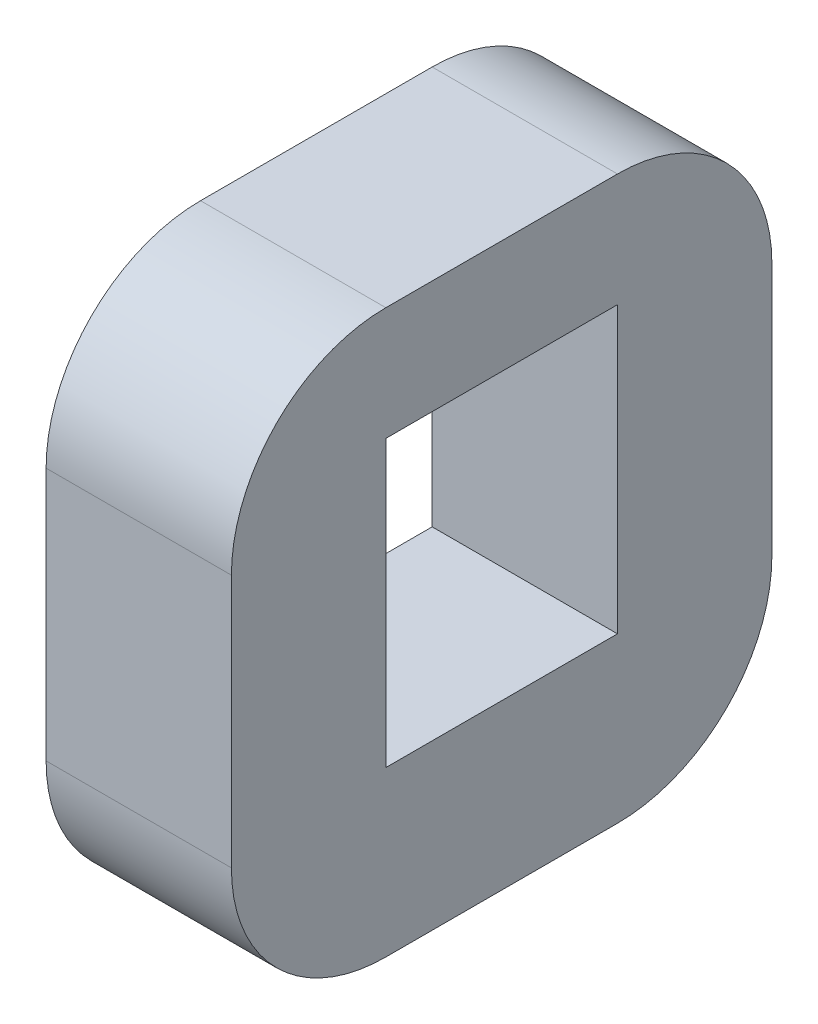
ISO-10303-21;
HEADER;
FILE_DESCRIPTION(('STEP AP214'),'2;1');
FILE_NAME('part.step','',(''),(''),'','','');
FILE_SCHEMA(('AUTOMOTIVE_DESIGN { 1 0 10303 214 1 1 1 1 }'));
ENDSEC;
DATA;
#1=APPLICATION_CONTEXT('core data for automotive mechanical design processes');
#2=APPLICATION_PROTOCOL_DEFINITION('international standard','automotive_design',2000,#1);
#3=PRODUCT_CONTEXT('',#1,'mechanical');
#4=PRODUCT('Part','Part','',(#3));
#5=PRODUCT_RELATED_PRODUCT_CATEGORY('part','',(#4));
#6=PRODUCT_DEFINITION_FORMATION('','',#4);
#7=PRODUCT_DEFINITION_CONTEXT('part definition',#1,'design');
#8=PRODUCT_DEFINITION('design','',#6,#7);
#9=PRODUCT_DEFINITION_SHAPE('','',#8);
#10=(LENGTH_UNIT() NAMED_UNIT(*) SI_UNIT(.MILLI.,.METRE.));
#11=(NAMED_UNIT(*) PLANE_ANGLE_UNIT() SI_UNIT($,.RADIAN.));
#12=(NAMED_UNIT(*) SI_UNIT($,.STERADIAN.) SOLID_ANGLE_UNIT());
#13=UNCERTAINTY_MEASURE_WITH_UNIT(LENGTH_MEASURE(1.E-05),#10,'distance_accuracy_value','');
#14=(GEOMETRIC_REPRESENTATION_CONTEXT(3) GLOBAL_UNCERTAINTY_ASSIGNED_CONTEXT((#13)) GLOBAL_UNIT_ASSIGNED_CONTEXT((#10,
#11,#12)) REPRESENTATION_CONTEXT('',''));
#15=CARTESIAN_POINT('',(0.,0.,0.));
#16=DIRECTION('',(0.,0.,1.));
#17=DIRECTION('',(1.,0.,0.));
#18=AXIS2_PLACEMENT_3D('',#15,#16,#17);
#19=CARTESIAN_POINT('',(-32.2981540502499,5.50000000000233,-0.749999999999997));
#20=DIRECTION('',(-1.,0.,0.));
#21=DIRECTION('',(0.,-1.,0.));
#22=AXIS2_PLACEMENT_3D('',#19,#20,#21);
#23=PLANE('',#22);
#24=CARTESIAN_POINT('',(-32.2981540502499,5.50000000000233,-0.749999999999997));
#25=DIRECTION('',(-1.,0.,0.));
#26=DIRECTION('',(0.,-1.,0.));
#27=AXIS2_PLACEMENT_3D('',#24,#25,#26);
#28=CIRCLE('',#27,5.);
#29=CARTESIAN_POINT('',(-32.2981540502497,10.5000000000023,-0.749999999999997));
#30=VERTEX_POINT('',#29);
#31=CARTESIAN_POINT('',(-32.2981540502499,5.50000000000233,-5.75));
#32=VERTEX_POINT('',#31);
#33=EDGE_CURVE('E154',#30,#32,#28,.T.);
#34=ORIENTED_EDGE('',*,*,#33,.T.);
#35=DIRECTION('',(0.,-1.,0.));
#36=VECTOR('',#35,1.);
#37=CARTESIAN_POINT('',(-32.2981540502499,5.50000000000233,-5.75));
#38=LINE('',#37,#36);
#39=CARTESIAN_POINT('',(-32.29815405025,-2.70774354332362,-5.75));
#40=VERTEX_POINT('',#39);
#41=EDGE_CURVE('E157',#32,#40,#38,.T.);
#42=ORIENTED_EDGE('',*,*,#41,.T.);
#43=CARTESIAN_POINT('',(-32.29815405025,-2.70774354332362,-0.749999999999997));
#44=DIRECTION('',(-1.,0.,0.));
#45=DIRECTION('',(0.,-1.,0.));
#46=AXIS2_PLACEMENT_3D('',#43,#44,#45);
#47=CIRCLE('',#46,5.);
#48=CARTESIAN_POINT('',(-32.2981540502502,-7.70774354332362,-0.749999999999997));
#49=VERTEX_POINT('',#48);
#50=EDGE_CURVE('E160',#40,#49,#47,.T.);
#51=ORIENTED_EDGE('',*,*,#50,.T.);
#52=DIRECTION('',(0.,0.,1.));
#53=VECTOR('',#52,1.);
#54=CARTESIAN_POINT('',(-32.2981540502502,-7.70774354332362,-0.749999999999998));
#55=LINE('',#54,#53);
#56=CARTESIAN_POINT('',(-32.2981540502502,-7.70774354332362,6.75));
#57=VERTEX_POINT('',#56);
#58=EDGE_CURVE('E162',#49,#57,#55,.T.);
#59=ORIENTED_EDGE('',*,*,#58,.T.);
#60=CARTESIAN_POINT('',(-32.29815405025,-2.70774354332362,6.75));
#61=DIRECTION('',(-1.,0.,0.));
#62=DIRECTION('',(0.,-1.,0.));
#63=AXIS2_PLACEMENT_3D('',#60,#61,#62);
#64=CIRCLE('',#63,5.);
#65=CARTESIAN_POINT('',(-32.29815405025,-2.70774354332362,11.75));
#66=VERTEX_POINT('',#65);
#67=EDGE_CURVE('E164',#57,#66,#64,.T.);
#68=ORIENTED_EDGE('',*,*,#67,.T.);
#69=DIRECTION('',(0.,1.,0.));
#70=VECTOR('',#69,1.);
#71=CARTESIAN_POINT('',(-32.29815405025,-2.70774354332362,11.75));
#72=LINE('',#71,#70);
#73=CARTESIAN_POINT('',(-32.2981540502499,5.50000000000233,11.75));
#74=VERTEX_POINT('',#73);
#75=EDGE_CURVE('E166',#66,#74,#72,.T.);
#76=ORIENTED_EDGE('',*,*,#75,.T.);
#77=CARTESIAN_POINT('',(-32.2981540502499,5.50000000000232,6.75));
#78=DIRECTION('',(-1.,0.,0.));
#79=DIRECTION('',(0.,-1.,0.));
#80=AXIS2_PLACEMENT_3D('',#77,#78,#79);
#81=CIRCLE('',#80,5.);
#82=CARTESIAN_POINT('',(-32.2981540502497,10.5000000000023,6.75));
#83=VERTEX_POINT('',#82);
#84=EDGE_CURVE('E168',#74,#83,#81,.T.);
#85=ORIENTED_EDGE('',*,*,#84,.T.);
#86=DIRECTION('',(0.,0.,-1.));
#87=VECTOR('',#86,1.);
#88=CARTESIAN_POINT('',(-32.2981540502497,10.5000000000023,6.75));
#89=LINE('',#88,#87);
#90=EDGE_CURVE('E170',#83,#30,#89,.T.);
#91=ORIENTED_EDGE('',*,*,#90,.T.);
#92=EDGE_LOOP('',(#34,#42,#51,#59,#68,#76,#85,#91));
#93=FACE_BOUND('',#92,.T.);
#94=DIRECTION('',(0.,1.,0.));
#95=VECTOR('',#94,1.);
#96=CARTESIAN_POINT('',(-32.29815405025,-2.39499999999976,6.75));
#97=LINE('',#96,#95);
#98=CARTESIAN_POINT('',(-32.29815405025,-2.39499999999976,6.75));
#99=VERTEX_POINT('',#98);
#100=CARTESIAN_POINT('',(-32.2981540502498,6.83500000000231,6.75));
#101=VERTEX_POINT('',#100);
#102=EDGE_CURVE('E136',#99,#101,#97,.T.);
#103=ORIENTED_EDGE('',*,*,#102,.F.);
#104=DIRECTION('',(0.,0.,1.));
#105=VECTOR('',#104,1.);
#106=CARTESIAN_POINT('',(-32.29815405025,-2.39499999999976,-0.749999999999996));
#107=LINE('',#106,#105);
#108=CARTESIAN_POINT('',(-32.29815405025,-2.39499999999976,-0.749999999999996));
#109=VERTEX_POINT('',#108);
#110=EDGE_CURVE('E122',#109,#99,#107,.T.);
#111=ORIENTED_EDGE('',*,*,#110,.F.);
#112=DIRECTION('',(0.,-1.,0.));
#113=VECTOR('',#112,1.);
#114=CARTESIAN_POINT('',(-32.29815405025,-0.354999999997694,-0.749999999999997));
#115=LINE('',#114,#113);
#116=CARTESIAN_POINT('',(-32.2981540502498,6.83500000000231,-0.749999999999996));
#117=VERTEX_POINT('',#116);
#118=EDGE_CURVE('E117',#117,#109,#115,.T.);
#119=ORIENTED_EDGE('',*,*,#118,.F.);
#120=DIRECTION('',(0.,0.,-1.));
#121=VECTOR('',#120,1.);
#122=CARTESIAN_POINT('',(-32.2981540502498,6.83500000000231,-0.749999999999996));
#123=LINE('',#122,#121);
#124=EDGE_CURVE('E138',#101,#117,#123,.T.);
#125=ORIENTED_EDGE('',*,*,#124,.F.);
#126=EDGE_LOOP('',(#103,#111,#119,#125));
#127=FACE_BOUND('',#126,.T.);
#128=ADVANCED_FACE('F31',(#93,#127),#23,.T.);
#129=CARTESIAN_POINT('',(-26.2981540502499,5.50000000000218,-0.749999999999997));
#130=DIRECTION('',(-1.,0.,0.));
#131=DIRECTION('',(0.,-1.,0.));
#132=AXIS2_PLACEMENT_3D('',#129,#130,#131);
#133=PLANE('',#132);
#134=CARTESIAN_POINT('',(-26.2981540502499,5.50000000000218,-0.749999999999997));
#135=DIRECTION('',(-1.,0.,0.));
#136=DIRECTION('',(0.,-1.,0.));
#137=AXIS2_PLACEMENT_3D('',#134,#135,#136);
#138=CIRCLE('',#137,5.);
#139=CARTESIAN_POINT('',(-26.2981540502497,10.5000000000022,-0.749999999999997));
#140=VERTEX_POINT('',#139);
#141=CARTESIAN_POINT('',(-26.2981540502499,5.50000000000218,-5.75));
#142=VERTEX_POINT('',#141);
#143=EDGE_CURVE('E132',#140,#142,#138,.T.);
#144=ORIENTED_EDGE('',*,*,#143,.F.);
#145=DIRECTION('',(0.,0.,-1.));
#146=VECTOR('',#145,1.);
#147=CARTESIAN_POINT('',(-26.2981540502497,10.5000000000022,6.75));
#148=LINE('',#147,#146);
#149=CARTESIAN_POINT('',(-26.2981540502497,10.5000000000022,6.75));
#150=VERTEX_POINT('',#149);
#151=EDGE_CURVE('E158',#150,#140,#148,.T.);
#152=ORIENTED_EDGE('',*,*,#151,.F.);
#153=CARTESIAN_POINT('',(-26.2981540502499,5.50000000000218,6.75));
#154=DIRECTION('',(-1.,0.,0.));
#155=DIRECTION('',(0.,-1.,0.));
#156=AXIS2_PLACEMENT_3D('',#153,#154,#155);
#157=CIRCLE('',#156,5.);
#158=CARTESIAN_POINT('',(-26.2981540502499,5.50000000000218,11.75));
#159=VERTEX_POINT('',#158);
#160=EDGE_CURVE('E185',#159,#150,#157,.T.);
#161=ORIENTED_EDGE('',*,*,#160,.F.);
#162=DIRECTION('',(0.,1.,0.));
#163=VECTOR('',#162,1.);
#164=CARTESIAN_POINT('',(-26.2981540502501,-2.70774354332377,11.75));
#165=LINE('',#164,#163);
#166=CARTESIAN_POINT('',(-26.2981540502501,-2.70774354332377,11.75));
#167=VERTEX_POINT('',#166);
#168=EDGE_CURVE('E183',#167,#159,#165,.T.);
#169=ORIENTED_EDGE('',*,*,#168,.F.);
#170=CARTESIAN_POINT('',(-26.2981540502501,-2.70774354332377,6.75));
#171=DIRECTION('',(-1.,0.,0.));
#172=DIRECTION('',(0.,-1.,0.));
#173=AXIS2_PLACEMENT_3D('',#170,#171,#172);
#174=CIRCLE('',#173,5.);
#175=CARTESIAN_POINT('',(-26.2981540502502,-7.70774354332377,6.75));
#176=VERTEX_POINT('',#175);
#177=EDGE_CURVE('E181',#176,#167,#174,.T.);
#178=ORIENTED_EDGE('',*,*,#177,.F.);
#179=DIRECTION('',(0.,0.,1.));
#180=VECTOR('',#179,1.);
#181=CARTESIAN_POINT('',(-26.2981540502502,-7.70774354332377,-0.749999999999998));
#182=LINE('',#181,#180);
#183=CARTESIAN_POINT('',(-26.2981540502502,-7.70774354332377,-0.749999999999997));
#184=VERTEX_POINT('',#183);
#185=EDGE_CURVE('E179',#184,#176,#182,.T.);
#186=ORIENTED_EDGE('',*,*,#185,.F.);
#187=CARTESIAN_POINT('',(-26.2981540502501,-2.70774354332377,-0.749999999999997));
#188=DIRECTION('',(-1.,0.,0.));
#189=DIRECTION('',(0.,-1.,0.));
#190=AXIS2_PLACEMENT_3D('',#187,#188,#189);
#191=CIRCLE('',#190,5.);
#192=CARTESIAN_POINT('',(-26.2981540502501,-2.70774354332377,-5.75));
#193=VERTEX_POINT('',#192);
#194=EDGE_CURVE('E177',#193,#184,#191,.T.);
#195=ORIENTED_EDGE('',*,*,#194,.F.);
#196=DIRECTION('',(0.,-1.,0.));
#197=VECTOR('',#196,1.);
#198=CARTESIAN_POINT('',(-26.2981540502499,5.50000000000218,-5.75));
#199=LINE('',#198,#197);
#200=EDGE_CURVE('E175',#142,#193,#199,.T.);
#201=ORIENTED_EDGE('',*,*,#200,.F.);
#202=EDGE_LOOP('',(#144,#152,#161,#169,#178,#186,#195,#201));
#203=FACE_BOUND('',#202,.T.);
#204=DIRECTION('',(0.,0.,1.));
#205=VECTOR('',#204,1.);
#206=CARTESIAN_POINT('',(-26.29815405025,-2.3949999999999,-0.749999999999996));
#207=LINE('',#206,#205);
#208=CARTESIAN_POINT('',(-26.29815405025,-2.39499999999991,-0.749999999999997));
#209=VERTEX_POINT('',#208);
#210=CARTESIAN_POINT('',(-26.29815405025,-2.3949999999999,6.75));
#211=VERTEX_POINT('',#210);
#212=EDGE_CURVE('E130',#209,#211,#207,.T.);
#213=ORIENTED_EDGE('',*,*,#212,.T.);
#214=DIRECTION('',(0.,1.,0.));
#215=VECTOR('',#214,1.);
#216=CARTESIAN_POINT('',(-26.2981540502498,6.83500000000216,6.75));
#217=LINE('',#216,#215);
#218=CARTESIAN_POINT('',(-26.2981540502498,6.83500000000216,6.75));
#219=VERTEX_POINT('',#218);
#220=EDGE_CURVE('E143',#211,#219,#217,.T.);
#221=ORIENTED_EDGE('',*,*,#220,.T.);
#222=DIRECTION('',(0.,0.,-1.));
#223=VECTOR('',#222,1.);
#224=CARTESIAN_POINT('',(-26.2981540502498,6.83500000000216,-0.749999999999996));
#225=LINE('',#224,#223);
#226=CARTESIAN_POINT('',(-26.2981540502498,6.83500000000216,-0.749999999999996));
#227=VERTEX_POINT('',#226);
#228=EDGE_CURVE('E146',#219,#227,#225,.T.);
#229=ORIENTED_EDGE('',*,*,#228,.T.);
#230=DIRECTION('',(0.,-1.,0.));
#231=VECTOR('',#230,1.);
#232=CARTESIAN_POINT('',(-26.29815405025,-0.354999999997839,-0.749999999999997));
#233=LINE('',#232,#231);
#234=EDGE_CURVE('E123',#227,#209,#233,.T.);
#235=ORIENTED_EDGE('',*,*,#234,.T.);
#236=EDGE_LOOP('',(#213,#221,#229,#235));
#237=FACE_BOUND('',#236,.T.);
#238=ADVANCED_FACE('F215',(#203,#237),#133,.F.);
#239=CARTESIAN_POINT('',(-32.2981540502499,5.50000000000233,-0.749999999999997));
#240=DIRECTION('',(1.,0.,0.));
#241=DIRECTION('',(0.,1.,0.));
#242=AXIS2_PLACEMENT_3D('',#239,#240,#241);
#243=CYLINDRICAL_SURFACE('',#242,5.);
#244=ORIENTED_EDGE('',*,*,#143,.T.);
#245=DIRECTION('',(1.,0.,0.));
#246=VECTOR('',#245,1.);
#247=CARTESIAN_POINT('',(-32.2981540502499,5.50000000000233,-5.75));
#248=LINE('',#247,#246);
#249=EDGE_CURVE('E11',#32,#142,#248,.T.);
#250=ORIENTED_EDGE('',*,*,#249,.F.);
#251=ORIENTED_EDGE('',*,*,#33,.F.);
#252=DIRECTION('',(1.,0.,0.));
#253=VECTOR('',#252,1.);
#254=CARTESIAN_POINT('',(-32.2981540502497,10.5000000000023,-0.749999999999997));
#255=LINE('',#254,#253);
#256=EDGE_CURVE('E172',#30,#140,#255,.T.);
#257=ORIENTED_EDGE('',*,*,#256,.T.);
#258=EDGE_LOOP('',(#244,#250,#251,#257));
#259=FACE_BOUND('',#258,.T.);
#260=ADVANCED_FACE('F33',(#259),#243,.T.);
#261=CARTESIAN_POINT('',(-32.2981540502499,5.50000000000233,-5.75));
#262=DIRECTION('',(0.,0.,1.));
#263=DIRECTION('',(1.,0.,0.));
#264=AXIS2_PLACEMENT_3D('',#261,#262,#263);
#265=PLANE('',#264);
#266=ORIENTED_EDGE('',*,*,#200,.T.);
#267=DIRECTION('',(1.,0.,0.));
#268=VECTOR('',#267,1.);
#269=CARTESIAN_POINT('',(-32.29815405025,-2.70774354332362,-5.75));
#270=LINE('',#269,#268);
#271=EDGE_CURVE('E39',#40,#193,#270,.T.);
#272=ORIENTED_EDGE('',*,*,#271,.F.);
#273=ORIENTED_EDGE('',*,*,#41,.F.);
#274=ORIENTED_EDGE('',*,*,#249,.T.);
#275=EDGE_LOOP('',(#266,#272,#273,#274));
#276=FACE_BOUND('',#275,.T.);
#277=ADVANCED_FACE('F232',(#276),#265,.F.);
#278=CARTESIAN_POINT('',(-32.29815405025,-2.70774354332362,-0.749999999999997));
#279=DIRECTION('',(1.,0.,0.));
#280=DIRECTION('',(0.,1.,0.));
#281=AXIS2_PLACEMENT_3D('',#278,#279,#280);
#282=CYLINDRICAL_SURFACE('',#281,5.);
#283=ORIENTED_EDGE('',*,*,#194,.T.);
#284=DIRECTION('',(1.,0.,0.));
#285=VECTOR('',#284,1.);
#286=CARTESIAN_POINT('',(-32.2981540502502,-7.70774354332362,-0.749999999999997));
#287=LINE('',#286,#285);
#288=EDGE_CURVE('E202',#49,#184,#287,.T.);
#289=ORIENTED_EDGE('',*,*,#288,.F.);
#290=ORIENTED_EDGE('',*,*,#50,.F.);
#291=ORIENTED_EDGE('',*,*,#271,.T.);
#292=EDGE_LOOP('',(#283,#289,#290,#291));
#293=FACE_BOUND('',#292,.T.);
#294=ADVANCED_FACE('F209',(#293),#282,.T.);
#295=CARTESIAN_POINT('',(-32.2981540502502,-7.70774354332362,-0.749999999999998));
#296=DIRECTION('',(0.,1.,0.));
#297=DIRECTION('',(-1.,0.,0.));
#298=AXIS2_PLACEMENT_3D('',#295,#296,#297);
#299=PLANE('',#298);
#300=ORIENTED_EDGE('',*,*,#185,.T.);
#301=DIRECTION('',(1.,0.,0.));
#302=VECTOR('',#301,1.);
#303=CARTESIAN_POINT('',(-32.2981540502502,-7.70774354332362,6.75));
#304=LINE('',#303,#302);
#305=EDGE_CURVE('E199',#57,#176,#304,.T.);
#306=ORIENTED_EDGE('',*,*,#305,.F.);
#307=ORIENTED_EDGE('',*,*,#58,.F.);
#308=ORIENTED_EDGE('',*,*,#288,.T.);
#309=EDGE_LOOP('',(#300,#306,#307,#308));
#310=FACE_BOUND('',#309,.T.);
#311=ADVANCED_FACE('F221',(#310),#299,.F.);
#312=CARTESIAN_POINT('',(-32.29815405025,-2.70774354332362,6.75));
#313=DIRECTION('',(1.,0.,0.));
#314=DIRECTION('',(0.,1.,0.));
#315=AXIS2_PLACEMENT_3D('',#312,#313,#314);
#316=CYLINDRICAL_SURFACE('',#315,5.);
#317=ORIENTED_EDGE('',*,*,#177,.T.);
#318=DIRECTION('',(1.,0.,0.));
#319=VECTOR('',#318,1.);
#320=CARTESIAN_POINT('',(-32.29815405025,-2.70774354332362,11.75));
#321=LINE('',#320,#319);
#322=EDGE_CURVE('E196',#66,#167,#321,.T.);
#323=ORIENTED_EDGE('',*,*,#322,.F.);
#324=ORIENTED_EDGE('',*,*,#67,.F.);
#325=ORIENTED_EDGE('',*,*,#305,.T.);
#326=EDGE_LOOP('',(#317,#323,#324,#325));
#327=FACE_BOUND('',#326,.T.);
#328=ADVANCED_FACE('F225',(#327),#316,.T.);
#329=CARTESIAN_POINT('',(-32.29815405025,-2.70774354332362,11.75));
#330=DIRECTION('',(0.,0.,-1.));
#331=DIRECTION('',(0.,1.,0.));
#332=AXIS2_PLACEMENT_3D('',#329,#330,#331);
#333=PLANE('',#332);
#334=ORIENTED_EDGE('',*,*,#168,.T.);
#335=DIRECTION('',(1.,0.,0.));
#336=VECTOR('',#335,1.);
#337=CARTESIAN_POINT('',(-32.2981540502499,5.50000000000233,11.75));
#338=LINE('',#337,#336);
#339=EDGE_CURVE('E193',#74,#159,#338,.T.);
#340=ORIENTED_EDGE('',*,*,#339,.F.);
#341=ORIENTED_EDGE('',*,*,#75,.F.);
#342=ORIENTED_EDGE('',*,*,#322,.T.);
#343=EDGE_LOOP('',(#334,#340,#341,#342));
#344=FACE_BOUND('',#343,.T.);
#345=ADVANCED_FACE('F245',(#344),#333,.F.);
#346=CARTESIAN_POINT('',(-32.2981540502499,5.50000000000232,6.75));
#347=DIRECTION('',(1.,0.,0.));
#348=DIRECTION('',(0.,1.,0.));
#349=AXIS2_PLACEMENT_3D('',#346,#347,#348);
#350=CYLINDRICAL_SURFACE('',#349,5.);
#351=ORIENTED_EDGE('',*,*,#160,.T.);
#352=DIRECTION('',(1.,0.,0.));
#353=VECTOR('',#352,1.);
#354=CARTESIAN_POINT('',(-32.2981540502497,10.5000000000023,6.75));
#355=LINE('',#354,#353);
#356=EDGE_CURVE('E190',#83,#150,#355,.T.);
#357=ORIENTED_EDGE('',*,*,#356,.F.);
#358=ORIENTED_EDGE('',*,*,#84,.F.);
#359=ORIENTED_EDGE('',*,*,#339,.T.);
#360=EDGE_LOOP('',(#351,#357,#358,#359));
#361=FACE_BOUND('',#360,.T.);
#362=ADVANCED_FACE('F243',(#361),#350,.T.);
#363=CARTESIAN_POINT('',(-32.2981540502497,10.5000000000023,6.75));
#364=DIRECTION('',(0.,-1.,0.));
#365=DIRECTION('',(1.,0.,0.));
#366=AXIS2_PLACEMENT_3D('',#363,#364,#365);
#367=PLANE('',#366);
#368=ORIENTED_EDGE('',*,*,#151,.T.);
#369=ORIENTED_EDGE('',*,*,#256,.F.);
#370=ORIENTED_EDGE('',*,*,#90,.F.);
#371=ORIENTED_EDGE('',*,*,#356,.T.);
#372=EDGE_LOOP('',(#368,#369,#370,#371));
#373=FACE_BOUND('',#372,.T.);
#374=ADVANCED_FACE('F238',(#373),#367,.F.);
#375=CARTESIAN_POINT('',(-32.29815405025,-2.39499999999976,-0.749999999999996));
#376=DIRECTION('',(0.,1.,0.));
#377=DIRECTION('',(-1.,0.,0.));
#378=AXIS2_PLACEMENT_3D('',#375,#376,#377);
#379=PLANE('',#378);
#380=ORIENTED_EDGE('',*,*,#212,.F.);
#381=DIRECTION('',(1.,0.,0.));
#382=VECTOR('',#381,1.);
#383=CARTESIAN_POINT('',(-32.29815405025,-2.39499999999976,-0.749999999999996));
#384=LINE('',#383,#382);
#385=EDGE_CURVE('E51',#109,#209,#384,.T.);
#386=ORIENTED_EDGE('',*,*,#385,.F.);
#387=ORIENTED_EDGE('',*,*,#110,.T.);
#388=DIRECTION('',(1.,0.,0.));
#389=VECTOR('',#388,1.);
#390=CARTESIAN_POINT('',(-32.29815405025,-2.39499999999976,6.75));
#391=LINE('',#390,#389);
#392=EDGE_CURVE('E133',#99,#211,#391,.T.);
#393=ORIENTED_EDGE('',*,*,#392,.T.);
#394=EDGE_LOOP('',(#380,#386,#387,#393));
#395=FACE_BOUND('',#394,.T.);
#396=ADVANCED_FACE('F126',(#395),#379,.T.);
#397=CARTESIAN_POINT('',(-32.2981540502498,6.83500000000231,6.75));
#398=DIRECTION('',(0.,0.,-1.));
#399=DIRECTION('',(0.,1.,0.));
#400=AXIS2_PLACEMENT_3D('',#397,#398,#399);
#401=PLANE('',#400);
#402=ORIENTED_EDGE('',*,*,#220,.F.);
#403=ORIENTED_EDGE('',*,*,#392,.F.);
#404=ORIENTED_EDGE('',*,*,#102,.T.);
#405=DIRECTION('',(1.,0.,0.));
#406=VECTOR('',#405,1.);
#407=CARTESIAN_POINT('',(-32.2981540502498,6.83500000000231,6.75));
#408=LINE('',#407,#406);
#409=EDGE_CURVE('E151',#101,#219,#408,.T.);
#410=ORIENTED_EDGE('',*,*,#409,.T.);
#411=EDGE_LOOP('',(#402,#403,#404,#410));
#412=FACE_BOUND('',#411,.T.);
#413=ADVANCED_FACE('F267',(#412),#401,.T.);
#414=CARTESIAN_POINT('',(-32.2981540502498,6.83500000000231,-0.749999999999996));
#415=DIRECTION('',(0.,-1.,0.));
#416=DIRECTION('',(1.,0.,0.));
#417=AXIS2_PLACEMENT_3D('',#414,#415,#416);
#418=PLANE('',#417);
#419=ORIENTED_EDGE('',*,*,#228,.F.);
#420=ORIENTED_EDGE('',*,*,#409,.F.);
#421=ORIENTED_EDGE('',*,*,#124,.T.);
#422=DIRECTION('',(1.,0.,0.));
#423=VECTOR('',#422,1.);
#424=CARTESIAN_POINT('',(-32.2981540502498,6.83500000000231,-0.749999999999996));
#425=LINE('',#424,#423);
#426=EDGE_CURVE('E46',#117,#227,#425,.T.);
#427=ORIENTED_EDGE('',*,*,#426,.T.);
#428=EDGE_LOOP('',(#419,#420,#421,#427));
#429=FACE_BOUND('',#428,.T.);
#430=ADVANCED_FACE('F271',(#429),#418,.T.);
#431=CARTESIAN_POINT('',(-32.29815405025,-0.354999999997694,-0.749999999999997));
#432=DIRECTION('',(0.,0.,1.));
#433=DIRECTION('',(0.,-1.,0.));
#434=AXIS2_PLACEMENT_3D('',#431,#432,#433);
#435=PLANE('',#434);
#436=ORIENTED_EDGE('',*,*,#234,.F.);
#437=ORIENTED_EDGE('',*,*,#426,.F.);
#438=ORIENTED_EDGE('',*,*,#118,.T.);
#439=ORIENTED_EDGE('',*,*,#385,.T.);
#440=EDGE_LOOP('',(#436,#437,#438,#439));
#441=FACE_BOUND('',#440,.T.);
#442=ADVANCED_FACE('F118',(#441),#435,.T.);
#443=CLOSED_SHELL('',(#128,#238,#260,#277,#294,#311,#328,#345,#362,#374,#396,#413,#430,#442));
#444=MANIFOLD_SOLID_BREP('B2',#443);
#445=ADVANCED_BREP_SHAPE_REPRESENTATION('',(#18,#444),#14);
#446=SHAPE_DEFINITION_REPRESENTATION(#9,#445);
ENDSEC;
END-ISO-10303-21;
